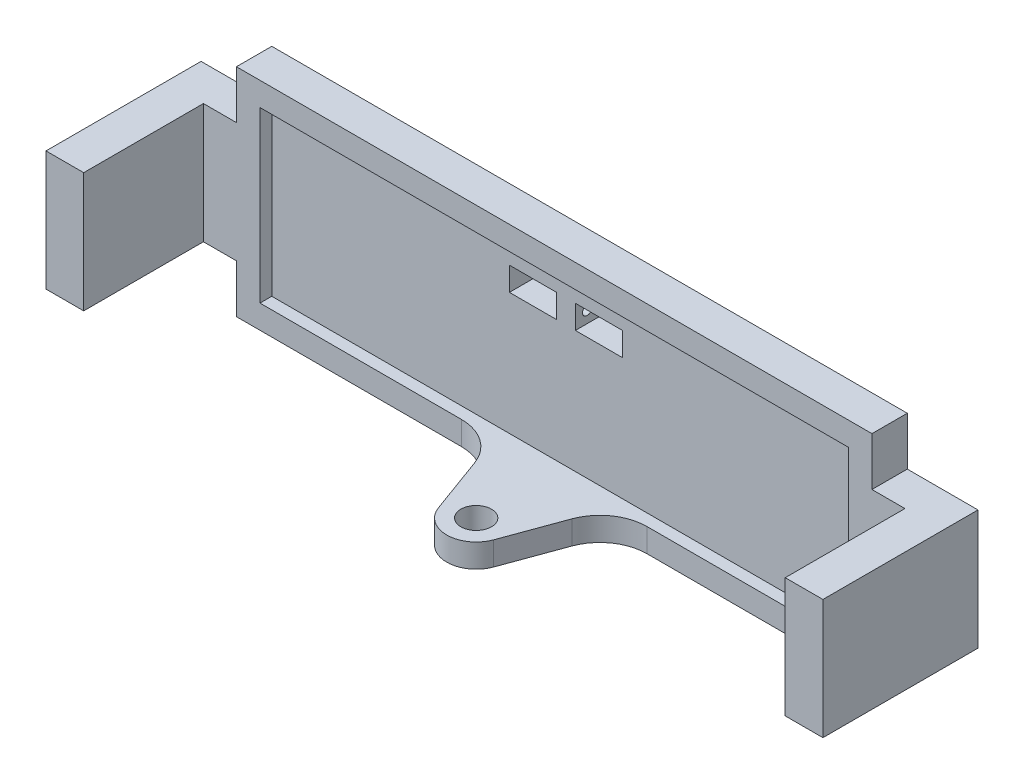
ISO-10303-21;
HEADER;
FILE_DESCRIPTION(('STEP AP214'),'2;1');
FILE_NAME('part.step','',(''),(''),'','','');
FILE_SCHEMA(('AUTOMOTIVE_DESIGN { 1 0 10303 214 1 1 1 1 }'));
ENDSEC;
DATA;
#1=APPLICATION_CONTEXT('core data for automotive mechanical design processes');
#2=APPLICATION_PROTOCOL_DEFINITION('international standard','automotive_design',2000,#1);
#3=PRODUCT_CONTEXT('',#1,'mechanical');
#4=PRODUCT('Part','Part','',(#3));
#5=PRODUCT_RELATED_PRODUCT_CATEGORY('part','',(#4));
#6=PRODUCT_DEFINITION_FORMATION('','',#4);
#7=PRODUCT_DEFINITION_CONTEXT('part definition',#1,'design');
#8=PRODUCT_DEFINITION('design','',#6,#7);
#9=PRODUCT_DEFINITION_SHAPE('','',#8);
#10=(LENGTH_UNIT() NAMED_UNIT(*) SI_UNIT(.MILLI.,.METRE.));
#11=(NAMED_UNIT(*) PLANE_ANGLE_UNIT() SI_UNIT($,.RADIAN.));
#12=(NAMED_UNIT(*) SI_UNIT($,.STERADIAN.) SOLID_ANGLE_UNIT());
#13=UNCERTAINTY_MEASURE_WITH_UNIT(LENGTH_MEASURE(1.E-05),#10,'distance_accuracy_value','');
#14=(GEOMETRIC_REPRESENTATION_CONTEXT(3) GLOBAL_UNCERTAINTY_ASSIGNED_CONTEXT((#13)) GLOBAL_UNIT_ASSIGNED_CONTEXT((#10,
#11,#12)) REPRESENTATION_CONTEXT('',''));
#15=CARTESIAN_POINT('',(0.,0.,0.));
#16=DIRECTION('',(0.,0.,1.));
#17=DIRECTION('',(1.,0.,0.));
#18=AXIS2_PLACEMENT_3D('',#15,#16,#17);
#19=CARTESIAN_POINT('',(0.,0.,5.));
#20=DIRECTION('',(0.,0.,-1.));
#21=DIRECTION('',(-1.,0.,0.));
#22=AXIS2_PLACEMENT_3D('',#19,#20,#21);
#23=PLANE('',#22);
#24=DIRECTION('',(-1.,0.,0.));
#25=VECTOR('',#24,1.);
#26=CARTESIAN_POINT('',(0.,12.7,5.));
#27=LINE('',#26,#25);
#28=CARTESIAN_POINT('',(-67.415,12.7000000000001,5.));
#29=VERTEX_POINT('',#28);
#30=CARTESIAN_POINT('',(-74.415,12.7000000000001,5.));
#31=VERTEX_POINT('',#30);
#32=EDGE_CURVE('E127',#29,#31,#27,.T.);
#33=ORIENTED_EDGE('',*,*,#32,.T.);
#34=DIRECTION('',(0.,-1.,0.));
#35=VECTOR('',#34,1.);
#36=CARTESIAN_POINT('',(-74.415,1.62632374758821E-13,5.));
#37=LINE('',#36,#35);
#38=CARTESIAN_POINT('',(-74.415,-12.6999999999999,5.));
#39=VERTEX_POINT('',#38);
#40=EDGE_CURVE('E122',#31,#39,#37,.T.);
#41=ORIENTED_EDGE('',*,*,#40,.T.);
#42=DIRECTION('',(-1.,0.,0.));
#43=VECTOR('',#42,1.);
#44=CARTESIAN_POINT('',(0.,-12.7,5.));
#45=LINE('',#44,#43);
#46=CARTESIAN_POINT('',(-67.415,-12.6999999999999,5.));
#47=VERTEX_POINT('',#46);
#48=EDGE_CURVE('E342',#47,#39,#45,.T.);
#49=ORIENTED_EDGE('',*,*,#48,.F.);
#50=DIRECTION('',(0.,1.,0.));
#51=VECTOR('',#50,1.);
#52=CARTESIAN_POINT('',(-67.415,0.,5.));
#53=LINE('',#52,#51);
#54=CARTESIAN_POINT('',(-67.415,-22.965,5.));
#55=VERTEX_POINT('',#54);
#56=EDGE_CURVE('E519',#55,#47,#53,.T.);
#57=ORIENTED_EDGE('',*,*,#56,.F.);
#58=DIRECTION('',(-1.,0.,0.));
#59=VECTOR('',#58,1.);
#60=CARTESIAN_POINT('',(0.,-22.965,5.));
#61=LINE('',#60,#59);
#62=CARTESIAN_POINT('',(-19.6932182980606,-22.965,5.));
#63=VERTEX_POINT('',#62);
#64=EDGE_CURVE('E507',#63,#55,#61,.T.);
#65=ORIENTED_EDGE('',*,*,#64,.F.);
#66=DIRECTION('',(0.,-1.,0.));
#67=VECTOR('',#66,1.);
#68=CARTESIAN_POINT('',(-19.6932182980606,0.,5.));
#69=LINE('',#68,#67);
#70=CARTESIAN_POINT('',(-19.6932182980606,-17.965,5.));
#71=VERTEX_POINT('',#70);
#72=EDGE_CURVE('E571',#63,#71,#69,.F.);
#73=ORIENTED_EDGE('',*,*,#72,.T.);
#74=DIRECTION('',(-1.,0.,0.));
#75=VECTOR('',#74,1.);
#76=CARTESIAN_POINT('',(0.,-17.965,5.));
#77=LINE('',#76,#75);
#78=CARTESIAN_POINT('',(-62.415,-17.965,5.));
#79=VERTEX_POINT('',#78);
#80=EDGE_CURVE('E490',#71,#79,#77,.T.);
#81=ORIENTED_EDGE('',*,*,#80,.T.);
#82=DIRECTION('',(0.,1.,0.));
#83=VECTOR('',#82,1.);
#84=CARTESIAN_POINT('',(-62.415,0.,5.));
#85=LINE('',#84,#83);
#86=CARTESIAN_POINT('',(-62.415,17.965,5.));
#87=VERTEX_POINT('',#86);
#88=EDGE_CURVE('E494',#79,#87,#85,.T.);
#89=ORIENTED_EDGE('',*,*,#88,.T.);
#90=DIRECTION('',(1.,0.,0.));
#91=VECTOR('',#90,1.);
#92=CARTESIAN_POINT('',(0.,17.965,5.));
#93=LINE('',#92,#91);
#94=CARTESIAN_POINT('',(62.415,17.965,5.));
#95=VERTEX_POINT('',#94);
#96=EDGE_CURVE('E497',#87,#95,#93,.T.);
#97=ORIENTED_EDGE('',*,*,#96,.T.);
#98=DIRECTION('',(0.,-1.,0.));
#99=VECTOR('',#98,1.);
#100=CARTESIAN_POINT('',(62.415,0.,5.));
#101=LINE('',#100,#99);
#102=CARTESIAN_POINT('',(62.415,-17.965,5.));
#103=VERTEX_POINT('',#102);
#104=EDGE_CURVE('E500',#95,#103,#101,.T.);
#105=ORIENTED_EDGE('',*,*,#104,.T.);
#106=CARTESIAN_POINT('',(19.6932182980606,-17.965,5.));
#107=VERTEX_POINT('',#106);
#108=EDGE_CURVE('E491',#103,#107,#77,.T.);
#109=ORIENTED_EDGE('',*,*,#108,.T.);
#110=DIRECTION('',(0.,-1.,0.));
#111=VECTOR('',#110,1.);
#112=CARTESIAN_POINT('',(19.6932182980606,-22.965,5.));
#113=LINE('',#112,#111);
#114=CARTESIAN_POINT('',(19.6932182980606,-22.965,5.));
#115=VERTEX_POINT('',#114);
#116=EDGE_CURVE('E568',#107,#115,#113,.T.);
#117=ORIENTED_EDGE('',*,*,#116,.T.);
#118=CARTESIAN_POINT('',(67.415,-22.965,5.));
#119=VERTEX_POINT('',#118);
#120=EDGE_CURVE('E515',#119,#115,#61,.T.);
#121=ORIENTED_EDGE('',*,*,#120,.F.);
#122=DIRECTION('',(0.,-1.,0.));
#123=VECTOR('',#122,1.);
#124=CARTESIAN_POINT('',(67.415,0.,5.));
#125=LINE('',#124,#123);
#126=CARTESIAN_POINT('',(67.415,-12.7,5.));
#127=VERTEX_POINT('',#126);
#128=EDGE_CURVE('E525',#127,#119,#125,.T.);
#129=ORIENTED_EDGE('',*,*,#128,.F.);
#130=DIRECTION('',(-1.,0.,0.));
#131=VECTOR('',#130,1.);
#132=CARTESIAN_POINT('',(0.,-12.7,5.));
#133=LINE('',#132,#131);
#134=CARTESIAN_POINT('',(74.415,-12.7,5.));
#135=VERTEX_POINT('',#134);
#136=EDGE_CURVE('E394',#135,#127,#133,.T.);
#137=ORIENTED_EDGE('',*,*,#136,.F.);
#138=DIRECTION('',(0.,-1.,0.));
#139=VECTOR('',#138,1.);
#140=CARTESIAN_POINT('',(74.415,0.,5.));
#141=LINE('',#140,#139);
#142=CARTESIAN_POINT('',(74.415,12.7,5.));
#143=VERTEX_POINT('',#142);
#144=EDGE_CURVE('E353',#143,#135,#141,.T.);
#145=ORIENTED_EDGE('',*,*,#144,.F.);
#146=DIRECTION('',(1.,0.,0.));
#147=VECTOR('',#146,1.);
#148=CARTESIAN_POINT('',(0.,12.7,5.));
#149=LINE('',#148,#147);
#150=CARTESIAN_POINT('',(67.415,12.7,5.));
#151=VERTEX_POINT('',#150);
#152=EDGE_CURVE('E391',#151,#143,#149,.T.);
#153=ORIENTED_EDGE('',*,*,#152,.F.);
#154=CARTESIAN_POINT('',(67.415,22.965,5.));
#155=VERTEX_POINT('',#154);
#156=EDGE_CURVE('E526',#155,#151,#125,.T.);
#157=ORIENTED_EDGE('',*,*,#156,.F.);
#158=DIRECTION('',(1.,0.,0.));
#159=VECTOR('',#158,1.);
#160=CARTESIAN_POINT('',(0.,22.965,5.));
#161=LINE('',#160,#159);
#162=CARTESIAN_POINT('',(-67.415,22.965,5.));
#163=VERTEX_POINT('',#162);
#164=EDGE_CURVE('E522',#163,#155,#161,.T.);
#165=ORIENTED_EDGE('',*,*,#164,.F.);
#166=EDGE_CURVE('E518',#29,#163,#53,.T.);
#167=ORIENTED_EDGE('',*,*,#166,.F.);
#168=EDGE_LOOP('',(#33,#41,#49,#57,#65,#73,#81,#89,#97,#105,#109,#117,#121,#129,#137,#145,#153,
#157,#165,#167));
#169=FACE_BOUND('',#168,.T.);
#170=ADVANCED_FACE('F107',(#169),#23,.F.);
#171=CARTESIAN_POINT('',(-67.415,0.,2.5));
#172=DIRECTION('',(1.,0.,0.));
#173=DIRECTION('',(0.,0.,-1.));
#174=AXIS2_PLACEMENT_3D('',#171,#172,#173);
#175=PLANE('',#174);
#176=DIRECTION('',(0.,0.,-1.));
#177=VECTOR('',#176,1.);
#178=CARTESIAN_POINT('',(-67.415,12.7000000000001,34.4984745368299));
#179=LINE('',#178,#177);
#180=CARTESIAN_POINT('',(-67.415,12.7000000000001,-2.5));
#181=VERTEX_POINT('',#180);
#182=EDGE_CURVE('E386',#29,#181,#179,.T.);
#183=ORIENTED_EDGE('',*,*,#182,.F.);
#184=ORIENTED_EDGE('',*,*,#166,.T.);
#185=DIRECTION('',(0.,0.,-1.));
#186=VECTOR('',#185,1.);
#187=CARTESIAN_POINT('',(-67.415,22.965,2.5));
#188=LINE('',#187,#186);
#189=CARTESIAN_POINT('',(-67.415,22.965,-2.5));
#190=VERTEX_POINT('',#189);
#191=EDGE_CURVE('E551',#163,#190,#188,.T.);
#192=ORIENTED_EDGE('',*,*,#191,.T.);
#193=DIRECTION('',(0.,-1.,0.));
#194=VECTOR('',#193,1.);
#195=CARTESIAN_POINT('',(-67.415,0.,-2.5));
#196=LINE('',#195,#194);
#197=EDGE_CURVE('E533',#190,#181,#196,.T.);
#198=ORIENTED_EDGE('',*,*,#197,.T.);
#199=EDGE_LOOP('',(#183,#184,#192,#198));
#200=FACE_BOUND('',#199,.T.);
#201=ADVANCED_FACE('F668',(#200),#175,.F.);
#202=CARTESIAN_POINT('',(67.415,0.,2.5));
#203=DIRECTION('',(1.,0.,0.));
#204=DIRECTION('',(0.,1.,0.));
#205=AXIS2_PLACEMENT_3D('',#202,#203,#204);
#206=PLANE('',#205);
#207=ORIENTED_EDGE('',*,*,#156,.T.);
#208=DIRECTION('',(0.,0.,-1.));
#209=VECTOR('',#208,1.);
#210=CARTESIAN_POINT('',(67.415,12.7,34.4984745368299));
#211=LINE('',#210,#209);
#212=CARTESIAN_POINT('',(67.415,12.7,-2.5));
#213=VERTEX_POINT('',#212);
#214=EDGE_CURVE('E409',#151,#213,#211,.T.);
#215=ORIENTED_EDGE('',*,*,#214,.T.);
#216=DIRECTION('',(0.,-1.,0.));
#217=VECTOR('',#216,1.);
#218=CARTESIAN_POINT('',(67.415,0.,-2.5));
#219=LINE('',#218,#217);
#220=CARTESIAN_POINT('',(67.415,22.965,-2.5));
#221=VERTEX_POINT('',#220);
#222=EDGE_CURVE('E540',#221,#213,#219,.T.);
#223=ORIENTED_EDGE('',*,*,#222,.F.);
#224=DIRECTION('',(0.,0.,-1.));
#225=VECTOR('',#224,1.);
#226=CARTESIAN_POINT('',(67.415,22.965,2.5));
#227=LINE('',#226,#225);
#228=EDGE_CURVE('E543',#155,#221,#227,.T.);
#229=ORIENTED_EDGE('',*,*,#228,.F.);
#230=EDGE_LOOP('',(#207,#215,#223,#229));
#231=FACE_BOUND('',#230,.T.);
#232=ADVANCED_FACE('F620',(#231),#206,.T.);
#233=CARTESIAN_POINT('',(0.,0.,-2.5));
#234=DIRECTION('',(0.,0.,1.));
#235=DIRECTION('',(1.,0.,0.));
#236=AXIS2_PLACEMENT_3D('',#233,#234,#235);
#237=PLANE('',#236);
#238=DIRECTION('',(-1.,0.,0.));
#239=VECTOR('',#238,1.);
#240=CARTESIAN_POINT('',(0.,12.965,-2.5));
#241=LINE('',#240,#239);
#242=CARTESIAN_POINT('',(12.,12.965,-2.5));
#243=VERTEX_POINT('',#242);
#244=CARTESIAN_POINT('',(2.,12.965,-2.5));
#245=VERTEX_POINT('',#244);
#246=EDGE_CURVE('E452',#243,#245,#241,.T.);
#247=ORIENTED_EDGE('',*,*,#246,.T.);
#248=DIRECTION('',(0.,-1.,0.));
#249=VECTOR('',#248,1.);
#250=CARTESIAN_POINT('',(2.,0.,-2.5));
#251=LINE('',#250,#249);
#252=CARTESIAN_POINT('',(2.,7.96500000000001,-2.5));
#253=VERTEX_POINT('',#252);
#254=EDGE_CURVE('E461',#245,#253,#251,.T.);
#255=ORIENTED_EDGE('',*,*,#254,.T.);
#256=DIRECTION('',(1.,0.,0.));
#257=VECTOR('',#256,1.);
#258=CARTESIAN_POINT('',(0.,7.96500000000001,-2.5));
#259=LINE('',#258,#257);
#260=CARTESIAN_POINT('',(12.,7.96500000000001,-2.5));
#261=VERTEX_POINT('',#260);
#262=EDGE_CURVE('E458',#253,#261,#259,.T.);
#263=ORIENTED_EDGE('',*,*,#262,.T.);
#264=DIRECTION('',(0.,1.,0.));
#265=VECTOR('',#264,1.);
#266=CARTESIAN_POINT('',(12.,0.,-2.5));
#267=LINE('',#266,#265);
#268=EDGE_CURVE('E455',#261,#243,#267,.T.);
#269=ORIENTED_EDGE('',*,*,#268,.T.);
#270=EDGE_LOOP('',(#247,#255,#263,#269));
#271=FACE_BOUND('',#270,.T.);
#272=DIRECTION('',(-1.,0.,0.));
#273=VECTOR('',#272,1.);
#274=CARTESIAN_POINT('',(0.,12.965,-2.5));
#275=LINE('',#274,#273);
#276=CARTESIAN_POINT('',(-1.99999999999997,12.965,-2.5));
#277=VERTEX_POINT('',#276);
#278=CARTESIAN_POINT('',(-12.,12.965,-2.5));
#279=VERTEX_POINT('',#278);
#280=EDGE_CURVE('E422',#277,#279,#275,.T.);
#281=ORIENTED_EDGE('',*,*,#280,.T.);
#282=DIRECTION('',(0.,-1.,0.));
#283=VECTOR('',#282,1.);
#284=CARTESIAN_POINT('',(-12.,0.,-2.5));
#285=LINE('',#284,#283);
#286=CARTESIAN_POINT('',(-12.,7.96500000000001,-2.5));
#287=VERTEX_POINT('',#286);
#288=EDGE_CURVE('E449',#279,#287,#285,.T.);
#289=ORIENTED_EDGE('',*,*,#288,.T.);
#290=DIRECTION('',(1.,0.,0.));
#291=VECTOR('',#290,1.);
#292=CARTESIAN_POINT('',(0.,7.96500000000001,-2.5));
#293=LINE('',#292,#291);
#294=CARTESIAN_POINT('',(-1.99999999999997,7.96500000000001,-2.5));
#295=VERTEX_POINT('',#294);
#296=EDGE_CURVE('E446',#287,#295,#293,.T.);
#297=ORIENTED_EDGE('',*,*,#296,.T.);
#298=DIRECTION('',(0.,1.,0.));
#299=VECTOR('',#298,1.);
#300=CARTESIAN_POINT('',(-1.99999999999997,0.,-2.5));
#301=LINE('',#300,#299);
#302=EDGE_CURVE('E443',#295,#277,#301,.T.);
#303=ORIENTED_EDGE('',*,*,#302,.T.);
#304=EDGE_LOOP('',(#281,#289,#297,#303));
#305=FACE_BOUND('',#304,.T.);
#306=DIRECTION('',(1.,0.,0.));
#307=VECTOR('',#306,1.);
#308=CARTESIAN_POINT('',(0.,22.965,-2.5));
#309=LINE('',#308,#307);
#310=EDGE_CURVE('E529',#190,#221,#309,.T.);
#311=ORIENTED_EDGE('',*,*,#310,.T.);
#312=ORIENTED_EDGE('',*,*,#222,.T.);
#313=DIRECTION('',(-1.,0.,0.));
#314=VECTOR('',#313,1.);
#315=CARTESIAN_POINT('',(0.,12.7,-2.5));
#316=LINE('',#315,#314);
#317=CARTESIAN_POINT('',(82.415,12.7,-2.5));
#318=VERTEX_POINT('',#317);
#319=EDGE_CURVE('E400',#318,#213,#316,.T.);
#320=ORIENTED_EDGE('',*,*,#319,.F.);
#321=DIRECTION('',(0.,-1.,0.));
#322=VECTOR('',#321,1.);
#323=CARTESIAN_POINT('',(82.415,0.,-2.5));
#324=LINE('',#323,#322);
#325=CARTESIAN_POINT('',(82.415,-12.7,-2.5));
#326=VERTEX_POINT('',#325);
#327=EDGE_CURVE('E402',#318,#326,#324,.T.);
#328=ORIENTED_EDGE('',*,*,#327,.T.);
#329=DIRECTION('',(1.,0.,0.));
#330=VECTOR('',#329,1.);
#331=CARTESIAN_POINT('',(0.,-12.7,-2.5));
#332=LINE('',#331,#330);
#333=CARTESIAN_POINT('',(67.415,-12.7,-2.5));
#334=VERTEX_POINT('',#333);
#335=EDGE_CURVE('E390',#334,#326,#332,.T.);
#336=ORIENTED_EDGE('',*,*,#335,.F.);
#337=CARTESIAN_POINT('',(67.415,-22.965,-2.5));
#338=VERTEX_POINT('',#337);
#339=EDGE_CURVE('E539',#334,#338,#219,.T.);
#340=ORIENTED_EDGE('',*,*,#339,.T.);
#341=DIRECTION('',(1.,0.,0.));
#342=VECTOR('',#341,1.);
#343=CARTESIAN_POINT('',(0.,-22.965,-2.5));
#344=LINE('',#343,#342);
#345=CARTESIAN_POINT('',(-67.415,-22.965,-2.5));
#346=VERTEX_POINT('',#345);
#347=EDGE_CURVE('E536',#346,#338,#344,.T.);
#348=ORIENTED_EDGE('',*,*,#347,.F.);
#349=CARTESIAN_POINT('',(-67.415,-12.6999999999999,-2.5));
#350=VERTEX_POINT('',#349);
#351=EDGE_CURVE('E532',#350,#346,#196,.T.);
#352=ORIENTED_EDGE('',*,*,#351,.F.);
#353=DIRECTION('',(1.,0.,0.));
#354=VECTOR('',#353,1.);
#355=CARTESIAN_POINT('',(0.,-12.7,-2.5));
#356=LINE('',#355,#354);
#357=CARTESIAN_POINT('',(-82.415,-12.6999999999999,-2.5));
#358=VERTEX_POINT('',#357);
#359=EDGE_CURVE('E379',#358,#350,#356,.T.);
#360=ORIENTED_EDGE('',*,*,#359,.F.);
#361=DIRECTION('',(0.,-1.,0.));
#362=VECTOR('',#361,1.);
#363=CARTESIAN_POINT('',(-82.415,1.80116201918272E-13,-2.5));
#364=LINE('',#363,#362);
#365=CARTESIAN_POINT('',(-82.415,12.7000000000001,-2.5));
#366=VERTEX_POINT('',#365);
#367=EDGE_CURVE('E369',#366,#358,#364,.T.);
#368=ORIENTED_EDGE('',*,*,#367,.F.);
#369=DIRECTION('',(1.,0.,0.));
#370=VECTOR('',#369,1.);
#371=CARTESIAN_POINT('',(0.,12.7,-2.5));
#372=LINE('',#371,#370);
#373=EDGE_CURVE('E376',#366,#181,#372,.T.);
#374=ORIENTED_EDGE('',*,*,#373,.T.);
#375=ORIENTED_EDGE('',*,*,#197,.F.);
#376=EDGE_LOOP('',(#311,#312,#320,#328,#336,#340,#348,#352,#360,#368,#374,#375));
#377=FACE_BOUND('',#376,.T.);
#378=ADVANCED_FACE('F616',(#271,#305,#377),#237,.F.);
#379=ORIENTED_EDGE('',*,*,#56,.T.);
#380=DIRECTION('',(0.,0.,-1.));
#381=VECTOR('',#380,1.);
#382=CARTESIAN_POINT('',(-67.415,-12.6999999999999,34.4984745368299));
#383=LINE('',#382,#381);
#384=EDGE_CURVE('E383',#47,#350,#383,.T.);
#385=ORIENTED_EDGE('',*,*,#384,.T.);
#386=ORIENTED_EDGE('',*,*,#351,.T.);
#387=DIRECTION('',(0.,0.,-1.));
#388=VECTOR('',#387,1.);
#389=CARTESIAN_POINT('',(-67.415,-22.965,2.5));
#390=LINE('',#389,#388);
#391=EDGE_CURVE('E548',#55,#346,#390,.T.);
#392=ORIENTED_EDGE('',*,*,#391,.F.);
#393=EDGE_LOOP('',(#379,#385,#386,#392));
#394=FACE_BOUND('',#393,.T.);
#395=ADVANCED_FACE('F619',(#394),#175,.F.);
#396=CARTESIAN_POINT('',(0.,-22.965,2.5));
#397=DIRECTION('',(0.,1.,0.));
#398=DIRECTION('',(0.,0.,1.));
#399=AXIS2_PLACEMENT_3D('',#396,#397,#398);
#400=PLANE('',#399);
#401=ORIENTED_EDGE('',*,*,#347,.T.);
#402=DIRECTION('',(0.,0.,-1.));
#403=VECTOR('',#402,1.);
#404=CARTESIAN_POINT('',(67.415,-22.965,2.5));
#405=LINE('',#404,#403);
#406=EDGE_CURVE('E545',#119,#338,#405,.T.);
#407=ORIENTED_EDGE('',*,*,#406,.F.);
#408=ORIENTED_EDGE('',*,*,#120,.T.);
#409=CARTESIAN_POINT('',(19.6932182980606,-22.965,15.));
#410=DIRECTION('',(0.,1.,0.));
#411=DIRECTION('',(0.,0.,1.));
#412=AXIS2_PLACEMENT_3D('',#409,#410,#411);
#413=CIRCLE('',#412,10.);
#414=CARTESIAN_POINT('',(10.3003658082339,-22.965,11.568626790284));
#415=VERTEX_POINT('',#414);
#416=EDGE_CURVE('E579',#115,#415,#413,.T.);
#417=ORIENTED_EDGE('',*,*,#416,.T.);
#418=DIRECTION('',(0.343137320971596,0.,-0.93928524898267));
#419=VECTOR('',#418,1.);
#420=CARTESIAN_POINT('',(12.816180212567,-22.965,4.68197466956128));
#421=LINE('',#420,#419);
#422=CARTESIAN_POINT('',(5.87053280614169,-22.965,23.6946082560725));
#423=VERTEX_POINT('',#422);
#424=EDGE_CURVE('E464',#423,#415,#421,.T.);
#425=ORIENTED_EDGE('',*,*,#424,.F.);
#426=CARTESIAN_POINT('',(0.,-22.965,21.55));
#427=DIRECTION('',(0.,-1.,0.));
#428=DIRECTION('',(0.,0.,-1.));
#429=AXIS2_PLACEMENT_3D('',#426,#427,#428);
#430=CIRCLE('',#429,6.25);
#431=CARTESIAN_POINT('',(-5.87053280614169,-22.965,23.6946082560725));
#432=VERTEX_POINT('',#431);
#433=EDGE_CURVE('E476',#423,#432,#430,.T.);
#434=ORIENTED_EDGE('',*,*,#433,.T.);
#435=DIRECTION('',(-0.343137320971596,0.,-0.93928524898267));
#436=VECTOR('',#435,1.);
#437=CARTESIAN_POINT('',(-12.816180212567,-22.965,4.68197466956128));
#438=LINE('',#437,#436);
#439=CARTESIAN_POINT('',(-10.3003658082339,-22.965,11.568626790284));
#440=VERTEX_POINT('',#439);
#441=EDGE_CURVE('E479',#432,#440,#438,.T.);
#442=ORIENTED_EDGE('',*,*,#441,.T.);
#443=CARTESIAN_POINT('',(-19.6932182980606,-22.965,15.));
#444=DIRECTION('',(0.,1.,0.));
#445=DIRECTION('',(0.,0.,1.));
#446=AXIS2_PLACEMENT_3D('',#443,#444,#445);
#447=CIRCLE('',#446,10.);
#448=EDGE_CURVE('E575',#440,#63,#447,.T.);
#449=ORIENTED_EDGE('',*,*,#448,.T.);
#450=ORIENTED_EDGE('',*,*,#64,.T.);
#451=ORIENTED_EDGE('',*,*,#391,.T.);
#452=EDGE_LOOP('',(#401,#407,#408,#417,#425,#434,#442,#449,#450,#451));
#453=FACE_BOUND('',#452,.T.);
#454=CARTESIAN_POINT('',(0.,-22.965,21.55));
#455=DIRECTION('',(0.,-1.,0.));
#456=DIRECTION('',(0.,0.,-1.));
#457=AXIS2_PLACEMENT_3D('',#454,#455,#456);
#458=CIRCLE('',#457,3.25);
#459=CARTESIAN_POINT('',(0.,-22.965,18.3));
#460=VERTEX_POINT('',#459);
#461=EDGE_CURVE('E482',#460,#460,#458,.T.);
#462=ORIENTED_EDGE('',*,*,#461,.F.);
#463=EDGE_LOOP('',(#462));
#464=FACE_BOUND('',#463,.T.);
#465=ADVANCED_FACE('F653',(#453,#464),#400,.F.);
#466=DIRECTION('',(0.,0.,-1.));
#467=VECTOR('',#466,1.);
#468=CARTESIAN_POINT('',(67.415,-12.7,34.4984745368299));
#469=LINE('',#468,#467);
#470=EDGE_CURVE('E405',#127,#334,#469,.T.);
#471=ORIENTED_EDGE('',*,*,#470,.F.);
#472=ORIENTED_EDGE('',*,*,#128,.T.);
#473=ORIENTED_EDGE('',*,*,#406,.T.);
#474=ORIENTED_EDGE('',*,*,#339,.F.);
#475=EDGE_LOOP('',(#471,#472,#473,#474));
#476=FACE_BOUND('',#475,.T.);
#477=ADVANCED_FACE('F648',(#476),#206,.T.);
#478=CARTESIAN_POINT('',(0.,22.965,2.5));
#479=DIRECTION('',(0.,1.,0.));
#480=DIRECTION('',(0.,0.,1.));
#481=AXIS2_PLACEMENT_3D('',#478,#479,#480);
#482=PLANE('',#481);
#483=ORIENTED_EDGE('',*,*,#310,.F.);
#484=ORIENTED_EDGE('',*,*,#191,.F.);
#485=ORIENTED_EDGE('',*,*,#164,.T.);
#486=ORIENTED_EDGE('',*,*,#228,.T.);
#487=EDGE_LOOP('',(#483,#484,#485,#486));
#488=FACE_BOUND('',#487,.T.);
#489=ADVANCED_FACE('F670',(#488),#482,.T.);
#490=CARTESIAN_POINT('',(0.,-17.965,5.));
#491=DIRECTION('',(0.,-1.,0.));
#492=DIRECTION('',(0.,0.,-1.));
#493=AXIS2_PLACEMENT_3D('',#490,#491,#492);
#494=PLANE('',#493);
#495=DIRECTION('',(1.,0.,0.));
#496=VECTOR('',#495,1.);
#497=CARTESIAN_POINT('',(0.,-17.965,2.5));
#498=LINE('',#497,#496);
#499=CARTESIAN_POINT('',(-62.415,-17.965,2.5));
#500=VERTEX_POINT('',#499);
#501=CARTESIAN_POINT('',(62.415,-17.965,2.5));
#502=VERTEX_POINT('',#501);
#503=EDGE_CURVE('E562',#500,#502,#498,.T.);
#504=ORIENTED_EDGE('',*,*,#503,.F.);
#505=DIRECTION('',(0.,0.,-1.));
#506=VECTOR('',#505,1.);
#507=CARTESIAN_POINT('',(-62.415,-17.965,5.));
#508=LINE('',#507,#506);
#509=EDGE_CURVE('E503',#79,#500,#508,.T.);
#510=ORIENTED_EDGE('',*,*,#509,.F.);
#511=ORIENTED_EDGE('',*,*,#80,.F.);
#512=CARTESIAN_POINT('',(-19.6932182980606,-17.965,15.));
#513=DIRECTION('',(0.,-1.,0.));
#514=DIRECTION('',(0.,0.,-1.));
#515=AXIS2_PLACEMENT_3D('',#512,#513,#514);
#516=CIRCLE('',#515,10.);
#517=CARTESIAN_POINT('',(-10.3003658082339,-17.965,11.568626790284));
#518=VERTEX_POINT('',#517);
#519=EDGE_CURVE('E577',#71,#518,#516,.T.);
#520=ORIENTED_EDGE('',*,*,#519,.T.);
#521=DIRECTION('',(0.343137320971596,0.,0.93928524898267));
#522=VECTOR('',#521,1.);
#523=CARTESIAN_POINT('',(-12.816180212567,-17.965,4.68197466956128));
#524=LINE('',#523,#522);
#525=CARTESIAN_POINT('',(-5.87053280614169,-17.965,23.6946082560725));
#526=VERTEX_POINT('',#525);
#527=EDGE_CURVE('E470',#518,#526,#524,.T.);
#528=ORIENTED_EDGE('',*,*,#527,.T.);
#529=CARTESIAN_POINT('',(0.,-17.965,21.55));
#530=DIRECTION('',(0.,-1.,0.));
#531=DIRECTION('',(0.,0.,-1.));
#532=AXIS2_PLACEMENT_3D('',#529,#530,#531);
#533=CIRCLE('',#532,6.25);
#534=CARTESIAN_POINT('',(5.87053280614169,-17.965,23.6946082560725));
#535=VERTEX_POINT('',#534);
#536=EDGE_CURVE('E465',#526,#535,#533,.F.);
#537=ORIENTED_EDGE('',*,*,#536,.T.);
#538=DIRECTION('',(-0.343137320971596,0.,0.93928524898267));
#539=VECTOR('',#538,1.);
#540=CARTESIAN_POINT('',(12.816180212567,-17.965,4.68197466956128));
#541=LINE('',#540,#539);
#542=CARTESIAN_POINT('',(10.3003658082339,-17.965,11.568626790284));
#543=VERTEX_POINT('',#542);
#544=EDGE_CURVE('E469',#543,#535,#541,.T.);
#545=ORIENTED_EDGE('',*,*,#544,.F.);
#546=CARTESIAN_POINT('',(19.6932182980606,-17.965,15.));
#547=DIRECTION('',(0.,-1.,0.));
#548=DIRECTION('',(0.,0.,-1.));
#549=AXIS2_PLACEMENT_3D('',#546,#547,#548);
#550=CIRCLE('',#549,10.);
#551=EDGE_CURVE('E581',#543,#107,#550,.T.);
#552=ORIENTED_EDGE('',*,*,#551,.T.);
#553=ORIENTED_EDGE('',*,*,#108,.F.);
#554=DIRECTION('',(0.,0.,-1.));
#555=VECTOR('',#554,1.);
#556=CARTESIAN_POINT('',(62.415,-17.965,5.));
#557=LINE('',#556,#555);
#558=EDGE_CURVE('E504',#103,#502,#557,.T.);
#559=ORIENTED_EDGE('',*,*,#558,.T.);
#560=EDGE_LOOP('',(#504,#510,#511,#520,#528,#537,#545,#552,#553,#559));
#561=FACE_BOUND('',#560,.T.);
#562=CARTESIAN_POINT('',(0.,-17.965,21.55));
#563=DIRECTION('',(0.,-1.,0.));
#564=DIRECTION('',(0.,0.,-1.));
#565=AXIS2_PLACEMENT_3D('',#562,#563,#564);
#566=CIRCLE('',#565,3.25);
#567=CARTESIAN_POINT('',(0.,-17.965,18.3));
#568=VERTEX_POINT('',#567);
#569=EDGE_CURVE('E468',#568,#568,#566,.F.);
#570=ORIENTED_EDGE('',*,*,#569,.F.);
#571=EDGE_LOOP('',(#570));
#572=FACE_BOUND('',#571,.T.);
#573=ADVANCED_FACE('F672',(#561,#572),#494,.F.);
#574=CARTESIAN_POINT('',(62.415,0.,5.));
#575=DIRECTION('',(1.,0.,0.));
#576=DIRECTION('',(0.,1.,0.));
#577=AXIS2_PLACEMENT_3D('',#574,#575,#576);
#578=PLANE('',#577);
#579=DIRECTION('',(0.,1.,0.));
#580=VECTOR('',#579,1.);
#581=CARTESIAN_POINT('',(62.415,0.,2.5));
#582=LINE('',#581,#580);
#583=CARTESIAN_POINT('',(62.415,17.965,2.5));
#584=VERTEX_POINT('',#583);
#585=EDGE_CURVE('E559',#502,#584,#582,.T.);
#586=ORIENTED_EDGE('',*,*,#585,.F.);
#587=ORIENTED_EDGE('',*,*,#558,.F.);
#588=ORIENTED_EDGE('',*,*,#104,.F.);
#589=DIRECTION('',(0.,0.,-1.));
#590=VECTOR('',#589,1.);
#591=CARTESIAN_POINT('',(62.415,17.965,5.));
#592=LINE('',#591,#590);
#593=EDGE_CURVE('E508',#95,#584,#592,.T.);
#594=ORIENTED_EDGE('',*,*,#593,.T.);
#595=EDGE_LOOP('',(#586,#587,#588,#594));
#596=FACE_BOUND('',#595,.T.);
#597=ADVANCED_FACE('F679',(#596),#578,.F.);
#598=CARTESIAN_POINT('',(0.,17.965,5.));
#599=DIRECTION('',(0.,1.,0.));
#600=DIRECTION('',(0.,0.,1.));
#601=AXIS2_PLACEMENT_3D('',#598,#599,#600);
#602=PLANE('',#601);
#603=DIRECTION('',(-1.,0.,0.));
#604=VECTOR('',#603,1.);
#605=CARTESIAN_POINT('',(0.,17.965,2.5));
#606=LINE('',#605,#604);
#607=CARTESIAN_POINT('',(-62.415,17.965,2.5));
#608=VERTEX_POINT('',#607);
#609=EDGE_CURVE('E556',#584,#608,#606,.T.);
#610=ORIENTED_EDGE('',*,*,#609,.F.);
#611=ORIENTED_EDGE('',*,*,#593,.F.);
#612=ORIENTED_EDGE('',*,*,#96,.F.);
#613=DIRECTION('',(0.,0.,-1.));
#614=VECTOR('',#613,1.);
#615=CARTESIAN_POINT('',(-62.415,17.965,5.));
#616=LINE('',#615,#614);
#617=EDGE_CURVE('E511',#87,#608,#616,.T.);
#618=ORIENTED_EDGE('',*,*,#617,.T.);
#619=EDGE_LOOP('',(#610,#611,#612,#618));
#620=FACE_BOUND('',#619,.T.);
#621=ADVANCED_FACE('F852',(#620),#602,.F.);
#622=CARTESIAN_POINT('',(-62.415,0.,5.));
#623=DIRECTION('',(-1.,0.,0.));
#624=DIRECTION('',(0.,-1.,0.));
#625=AXIS2_PLACEMENT_3D('',#622,#623,#624);
#626=PLANE('',#625);
#627=DIRECTION('',(0.,-1.,0.));
#628=VECTOR('',#627,1.);
#629=CARTESIAN_POINT('',(-62.415,0.,2.5));
#630=LINE('',#629,#628);
#631=EDGE_CURVE('E553',#608,#500,#630,.T.);
#632=ORIENTED_EDGE('',*,*,#631,.F.);
#633=ORIENTED_EDGE('',*,*,#617,.F.);
#634=ORIENTED_EDGE('',*,*,#88,.F.);
#635=ORIENTED_EDGE('',*,*,#509,.T.);
#636=EDGE_LOOP('',(#632,#633,#634,#635));
#637=FACE_BOUND('',#636,.T.);
#638=ADVANCED_FACE('F695',(#637),#626,.F.);
#639=CARTESIAN_POINT('',(0.,0.,2.5));
#640=DIRECTION('',(0.,0.,1.));
#641=DIRECTION('',(1.,0.,0.));
#642=AXIS2_PLACEMENT_3D('',#639,#640,#641);
#643=PLANE('',#642);
#644=DIRECTION('',(0.,-1.,0.));
#645=VECTOR('',#644,1.);
#646=CARTESIAN_POINT('',(2.,0.,2.5));
#647=LINE('',#646,#645);
#648=CARTESIAN_POINT('',(2.,12.965,2.5));
#649=VERTEX_POINT('',#648);
#650=CARTESIAN_POINT('',(2.,7.96500000000001,2.5));
#651=VERTEX_POINT('',#650);
#652=EDGE_CURVE('E12',#649,#651,#647,.T.);
#653=ORIENTED_EDGE('',*,*,#652,.F.);
#654=DIRECTION('',(-1.,0.,0.));
#655=VECTOR('',#654,1.);
#656=CARTESIAN_POINT('',(0.,12.965,2.5));
#657=LINE('',#656,#655);
#658=CARTESIAN_POINT('',(12.,12.965,2.5));
#659=VERTEX_POINT('',#658);
#660=EDGE_CURVE('E592',#659,#649,#657,.T.);
#661=ORIENTED_EDGE('',*,*,#660,.F.);
#662=DIRECTION('',(0.,1.,0.));
#663=VECTOR('',#662,1.);
#664=CARTESIAN_POINT('',(12.,0.,2.5));
#665=LINE('',#664,#663);
#666=CARTESIAN_POINT('',(12.,7.96500000000001,2.5));
#667=VERTEX_POINT('',#666);
#668=EDGE_CURVE('E594',#667,#659,#665,.T.);
#669=ORIENTED_EDGE('',*,*,#668,.F.);
#670=DIRECTION('',(1.,0.,0.));
#671=VECTOR('',#670,1.);
#672=CARTESIAN_POINT('',(0.,7.96500000000001,2.5));
#673=LINE('',#672,#671);
#674=EDGE_CURVE('E115',#651,#667,#673,.T.);
#675=ORIENTED_EDGE('',*,*,#674,.F.);
#676=EDGE_LOOP('',(#653,#661,#669,#675));
#677=FACE_BOUND('',#676,.T.);
#678=DIRECTION('',(0.,-1.,0.));
#679=VECTOR('',#678,1.);
#680=CARTESIAN_POINT('',(-12.,0.,2.5));
#681=LINE('',#680,#679);
#682=CARTESIAN_POINT('',(-12.,12.965,2.5));
#683=VERTEX_POINT('',#682);
#684=CARTESIAN_POINT('',(-12.,7.96500000000001,2.5));
#685=VERTEX_POINT('',#684);
#686=EDGE_CURVE('E590',#683,#685,#681,.T.);
#687=ORIENTED_EDGE('',*,*,#686,.F.);
#688=DIRECTION('',(-1.,0.,0.));
#689=VECTOR('',#688,1.);
#690=CARTESIAN_POINT('',(0.,12.965,2.5));
#691=LINE('',#690,#689);
#692=CARTESIAN_POINT('',(-1.99999999999997,12.965,2.5));
#693=VERTEX_POINT('',#692);
#694=EDGE_CURVE('E583',#693,#683,#691,.T.);
#695=ORIENTED_EDGE('',*,*,#694,.F.);
#696=DIRECTION('',(0.,1.,0.));
#697=VECTOR('',#696,1.);
#698=CARTESIAN_POINT('',(-1.99999999999997,0.,2.5));
#699=LINE('',#698,#697);
#700=CARTESIAN_POINT('',(-1.99999999999997,7.96500000000001,2.5));
#701=VERTEX_POINT('',#700);
#702=EDGE_CURVE('E585',#701,#693,#699,.T.);
#703=ORIENTED_EDGE('',*,*,#702,.F.);
#704=DIRECTION('',(1.,0.,0.));
#705=VECTOR('',#704,1.);
#706=CARTESIAN_POINT('',(0.,7.96500000000001,2.5));
#707=LINE('',#706,#705);
#708=EDGE_CURVE('E588',#685,#701,#707,.T.);
#709=ORIENTED_EDGE('',*,*,#708,.F.);
#710=EDGE_LOOP('',(#687,#695,#703,#709));
#711=FACE_BOUND('',#710,.T.);
#712=ORIENTED_EDGE('',*,*,#631,.T.);
#713=ORIENTED_EDGE('',*,*,#503,.T.);
#714=ORIENTED_EDGE('',*,*,#585,.T.);
#715=ORIENTED_EDGE('',*,*,#609,.T.);
#716=EDGE_LOOP('',(#712,#713,#714,#715));
#717=FACE_BOUND('',#716,.T.);
#718=ADVANCED_FACE('F607',(#677,#711,#717),#643,.T.);
#719=CARTESIAN_POINT('',(0.,16.167096331752,21.55));
#720=DIRECTION('',(0.,-1.,0.));
#721=DIRECTION('',(0.,0.,-1.));
#722=AXIS2_PLACEMENT_3D('',#719,#720,#721);
#723=CYLINDRICAL_SURFACE('',#722,6.25);
#724=ORIENTED_EDGE('',*,*,#536,.F.);
#725=DIRECTION('',(0.,-1.,0.));
#726=VECTOR('',#725,1.);
#727=CARTESIAN_POINT('',(-5.87053280614169,16.167096331752,23.6946082560725));
#728=LINE('',#727,#726);
#729=EDGE_CURVE('E472',#526,#432,#728,.T.);
#730=ORIENTED_EDGE('',*,*,#729,.T.);
#731=ORIENTED_EDGE('',*,*,#433,.F.);
#732=DIRECTION('',(0.,-1.,0.));
#733=VECTOR('',#732,1.);
#734=CARTESIAN_POINT('',(5.87053280614169,16.167096331752,23.6946082560725));
#735=LINE('',#734,#733);
#736=EDGE_CURVE('E485',#535,#423,#735,.T.);
#737=ORIENTED_EDGE('',*,*,#736,.F.);
#738=EDGE_LOOP('',(#724,#730,#731,#737));
#739=FACE_BOUND('',#738,.T.);
#740=ADVANCED_FACE('F694',(#739),#723,.T.);
#741=CARTESIAN_POINT('',(-12.816180212567,16.167096331752,4.68197466956128));
#742=DIRECTION('',(-0.93928524898267,0.,0.343137320971596));
#743=DIRECTION('',(0.343137320971596,0.,0.93928524898267));
#744=AXIS2_PLACEMENT_3D('',#741,#742,#743);
#745=PLANE('',#744);
#746=ORIENTED_EDGE('',*,*,#527,.F.);
#747=DIRECTION('',(0.,-1.,0.));
#748=VECTOR('',#747,1.);
#749=CARTESIAN_POINT('',(-10.3003658082339,16.167096331752,11.568626790284));
#750=LINE('',#749,#748);
#751=EDGE_CURVE('E565',#518,#440,#750,.T.);
#752=ORIENTED_EDGE('',*,*,#751,.T.);
#753=ORIENTED_EDGE('',*,*,#441,.F.);
#754=ORIENTED_EDGE('',*,*,#729,.F.);
#755=EDGE_LOOP('',(#746,#752,#753,#754));
#756=FACE_BOUND('',#755,.T.);
#757=ADVANCED_FACE('F841',(#756),#745,.T.);
#758=CARTESIAN_POINT('',(12.816180212567,16.167096331752,4.68197466956128));
#759=DIRECTION('',(-0.93928524898267,0.,-0.343137320971596));
#760=DIRECTION('',(-0.343137320971596,0.,0.93928524898267));
#761=AXIS2_PLACEMENT_3D('',#758,#759,#760);
#762=PLANE('',#761);
#763=ORIENTED_EDGE('',*,*,#424,.T.);
#764=DIRECTION('',(0.,-1.,0.));
#765=VECTOR('',#764,1.);
#766=CARTESIAN_POINT('',(10.3003658082339,-17.965,11.568626790284));
#767=LINE('',#766,#765);
#768=EDGE_CURVE('E573',#415,#543,#767,.F.);
#769=ORIENTED_EDGE('',*,*,#768,.T.);
#770=ORIENTED_EDGE('',*,*,#544,.T.);
#771=ORIENTED_EDGE('',*,*,#736,.T.);
#772=EDGE_LOOP('',(#763,#769,#770,#771));
#773=FACE_BOUND('',#772,.T.);
#774=ADVANCED_FACE('F839',(#773),#762,.F.);
#775=CARTESIAN_POINT('',(0.,16.167096331752,21.55));
#776=DIRECTION('',(0.,-1.,0.));
#777=DIRECTION('',(0.,0.,-1.));
#778=AXIS2_PLACEMENT_3D('',#775,#776,#777);
#779=CYLINDRICAL_SURFACE('',#778,3.25);
#780=ORIENTED_EDGE('',*,*,#569,.T.);
#781=EDGE_LOOP('',(#780));
#782=FACE_BOUND('',#781,.T.);
#783=ORIENTED_EDGE('',*,*,#461,.T.);
#784=EDGE_LOOP('',(#783));
#785=FACE_BOUND('',#784,.T.);
#786=ADVANCED_FACE('F835',(#782,#785),#779,.F.);
#787=CARTESIAN_POINT('',(-19.6932182980606,16.167096331752,15.));
#788=DIRECTION('',(0.,-1.,0.));
#789=DIRECTION('',(0.,0.,-1.));
#790=AXIS2_PLACEMENT_3D('',#787,#788,#789);
#791=CYLINDRICAL_SURFACE('',#790,10.);
#792=ORIENTED_EDGE('',*,*,#519,.F.);
#793=ORIENTED_EDGE('',*,*,#72,.F.);
#794=ORIENTED_EDGE('',*,*,#448,.F.);
#795=ORIENTED_EDGE('',*,*,#751,.F.);
#796=EDGE_LOOP('',(#792,#793,#794,#795));
#797=FACE_BOUND('',#796,.T.);
#798=ADVANCED_FACE('F838',(#797),#791,.F.);
#799=CARTESIAN_POINT('',(19.6932182980606,0.,15.));
#800=DIRECTION('',(0.,1.,0.));
#801=DIRECTION('',(0.,0.,1.));
#802=AXIS2_PLACEMENT_3D('',#799,#800,#801);
#803=CYLINDRICAL_SURFACE('',#802,10.);
#804=ORIENTED_EDGE('',*,*,#551,.F.);
#805=ORIENTED_EDGE('',*,*,#768,.F.);
#806=ORIENTED_EDGE('',*,*,#416,.F.);
#807=ORIENTED_EDGE('',*,*,#116,.F.);
#808=EDGE_LOOP('',(#804,#805,#806,#807));
#809=FACE_BOUND('',#808,.T.);
#810=ADVANCED_FACE('F109',(#809),#803,.F.);
#811=CARTESIAN_POINT('',(-12.,12.965,27.8));
#812=DIRECTION('',(-1.,0.,0.));
#813=DIRECTION('',(0.,-1.,0.));
#814=AXIS2_PLACEMENT_3D('',#811,#812,#813);
#815=PLANE('',#814);
#816=DIRECTION('',(0.,0.,-1.));
#817=VECTOR('',#816,1.);
#818=CARTESIAN_POINT('',(-12.,12.965,27.8));
#819=LINE('',#818,#817);
#820=EDGE_CURVE('E416',#683,#279,#819,.T.);
#821=ORIENTED_EDGE('',*,*,#820,.F.);
#822=ORIENTED_EDGE('',*,*,#686,.T.);
#823=DIRECTION('',(0.,0.,-1.));
#824=VECTOR('',#823,1.);
#825=CARTESIAN_POINT('',(-12.,7.96500000000001,27.8));
#826=LINE('',#825,#824);
#827=EDGE_CURVE('E431',#685,#287,#826,.T.);
#828=ORIENTED_EDGE('',*,*,#827,.T.);
#829=ORIENTED_EDGE('',*,*,#288,.F.);
#830=EDGE_LOOP('',(#821,#822,#828,#829));
#831=FACE_BOUND('',#830,.T.);
#832=ADVANCED_FACE('F824',(#831),#815,.F.);
#833=CARTESIAN_POINT('',(-12.,7.96500000000001,27.8));
#834=DIRECTION('',(0.,-1.,0.));
#835=DIRECTION('',(0.,0.,-1.));
#836=AXIS2_PLACEMENT_3D('',#833,#834,#835);
#837=PLANE('',#836);
#838=ORIENTED_EDGE('',*,*,#827,.F.);
#839=ORIENTED_EDGE('',*,*,#708,.T.);
#840=DIRECTION('',(0.,0.,-1.));
#841=VECTOR('',#840,1.);
#842=CARTESIAN_POINT('',(-1.99999999999997,7.96500000000001,27.8));
#843=LINE('',#842,#841);
#844=EDGE_CURVE('E434',#701,#295,#843,.T.);
#845=ORIENTED_EDGE('',*,*,#844,.T.);
#846=ORIENTED_EDGE('',*,*,#296,.F.);
#847=EDGE_LOOP('',(#838,#839,#845,#846));
#848=FACE_BOUND('',#847,.T.);
#849=ADVANCED_FACE('F820',(#848),#837,.F.);
#850=CARTESIAN_POINT('',(-1.99999999999997,12.965,27.8));
#851=DIRECTION('',(1.,0.,0.));
#852=DIRECTION('',(0.,0.,-1.));
#853=AXIS2_PLACEMENT_3D('',#850,#851,#852);
#854=PLANE('',#853);
#855=CARTESIAN_POINT('',(-1.99999999999997,10.465,0.));
#856=DIRECTION('',(1.,0.,0.));
#857=DIRECTION('',(0.,0.,-1.));
#858=AXIS2_PLACEMENT_3D('',#855,#856,#857);
#859=CIRCLE('',#858,1.);
#860=CARTESIAN_POINT('',(-1.99999999999997,10.465,-1.));
#861=VERTEX_POINT('',#860);
#862=EDGE_CURVE('E397',#861,#861,#859,.T.);
#863=ORIENTED_EDGE('',*,*,#862,.T.);
#864=EDGE_LOOP('',(#863));
#865=FACE_BOUND('',#864,.T.);
#866=ORIENTED_EDGE('',*,*,#844,.F.);
#867=ORIENTED_EDGE('',*,*,#702,.T.);
#868=DIRECTION('',(0.,0.,-1.));
#869=VECTOR('',#868,1.);
#870=CARTESIAN_POINT('',(-1.99999999999997,12.965,27.8));
#871=LINE('',#870,#869);
#872=EDGE_CURVE('E437',#693,#277,#871,.T.);
#873=ORIENTED_EDGE('',*,*,#872,.T.);
#874=ORIENTED_EDGE('',*,*,#302,.F.);
#875=EDGE_LOOP('',(#866,#867,#873,#874));
#876=FACE_BOUND('',#875,.T.);
#877=ADVANCED_FACE('F823',(#865,#876),#854,.F.);
#878=CARTESIAN_POINT('',(-12.,12.965,27.8));
#879=DIRECTION('',(0.,1.,0.));
#880=DIRECTION('',(0.,0.,1.));
#881=AXIS2_PLACEMENT_3D('',#878,#879,#880);
#882=PLANE('',#881);
#883=ORIENTED_EDGE('',*,*,#872,.F.);
#884=ORIENTED_EDGE('',*,*,#694,.T.);
#885=ORIENTED_EDGE('',*,*,#820,.T.);
#886=ORIENTED_EDGE('',*,*,#280,.F.);
#887=EDGE_LOOP('',(#883,#884,#885,#886));
#888=FACE_BOUND('',#887,.T.);
#889=ADVANCED_FACE('F818',(#888),#882,.F.);
#890=CARTESIAN_POINT('',(2.,12.965,27.8));
#891=DIRECTION('',(-1.,0.,0.));
#892=DIRECTION('',(0.,0.,1.));
#893=AXIS2_PLACEMENT_3D('',#890,#891,#892);
#894=PLANE('',#893);
#895=CARTESIAN_POINT('',(2.,10.465,0.));
#896=DIRECTION('',(-1.,0.,0.));
#897=DIRECTION('',(0.,0.,1.));
#898=AXIS2_PLACEMENT_3D('',#895,#896,#897);
#899=CIRCLE('',#898,1.);
#900=CARTESIAN_POINT('',(2.,10.465,1.));
#901=VERTEX_POINT('',#900);
#902=EDGE_CURVE('E413',#901,#901,#899,.T.);
#903=ORIENTED_EDGE('',*,*,#902,.T.);
#904=EDGE_LOOP('',(#903));
#905=FACE_BOUND('',#904,.T.);
#906=DIRECTION('',(0.,0.,-1.));
#907=VECTOR('',#906,1.);
#908=CARTESIAN_POINT('',(2.,12.965,27.8));
#909=LINE('',#908,#907);
#910=EDGE_CURVE('E429',#649,#245,#909,.T.);
#911=ORIENTED_EDGE('',*,*,#910,.F.);
#912=ORIENTED_EDGE('',*,*,#652,.T.);
#913=DIRECTION('',(0.,0.,-1.));
#914=VECTOR('',#913,1.);
#915=CARTESIAN_POINT('',(2.,7.96500000000001,27.8));
#916=LINE('',#915,#914);
#917=EDGE_CURVE('E419',#651,#253,#916,.T.);
#918=ORIENTED_EDGE('',*,*,#917,.T.);
#919=ORIENTED_EDGE('',*,*,#254,.F.);
#920=EDGE_LOOP('',(#911,#912,#918,#919));
#921=FACE_BOUND('',#920,.T.);
#922=ADVANCED_FACE('F614',(#905,#921),#894,.F.);
#923=CARTESIAN_POINT('',(12.,7.96500000000001,27.8));
#924=DIRECTION('',(0.,-1.,0.));
#925=DIRECTION('',(0.,0.,-1.));
#926=AXIS2_PLACEMENT_3D('',#923,#924,#925);
#927=PLANE('',#926);
#928=ORIENTED_EDGE('',*,*,#917,.F.);
#929=ORIENTED_EDGE('',*,*,#674,.T.);
#930=DIRECTION('',(0.,0.,-1.));
#931=VECTOR('',#930,1.);
#932=CARTESIAN_POINT('',(12.,7.96500000000001,27.8));
#933=LINE('',#932,#931);
#934=EDGE_CURVE('E423',#667,#261,#933,.T.);
#935=ORIENTED_EDGE('',*,*,#934,.T.);
#936=ORIENTED_EDGE('',*,*,#262,.F.);
#937=EDGE_LOOP('',(#928,#929,#935,#936));
#938=FACE_BOUND('',#937,.T.);
#939=ADVANCED_FACE('F600',(#938),#927,.F.);
#940=CARTESIAN_POINT('',(12.,12.965,27.8));
#941=DIRECTION('',(1.,0.,0.));
#942=DIRECTION('',(0.,1.,0.));
#943=AXIS2_PLACEMENT_3D('',#940,#941,#942);
#944=PLANE('',#943);
#945=ORIENTED_EDGE('',*,*,#934,.F.);
#946=ORIENTED_EDGE('',*,*,#668,.T.);
#947=DIRECTION('',(0.,0.,-1.));
#948=VECTOR('',#947,1.);
#949=CARTESIAN_POINT('',(12.,12.965,27.8));
#950=LINE('',#949,#948);
#951=EDGE_CURVE('E426',#659,#243,#950,.T.);
#952=ORIENTED_EDGE('',*,*,#951,.T.);
#953=ORIENTED_EDGE('',*,*,#268,.F.);
#954=EDGE_LOOP('',(#945,#946,#952,#953));
#955=FACE_BOUND('',#954,.T.);
#956=ADVANCED_FACE('F605',(#955),#944,.F.);
#957=CARTESIAN_POINT('',(12.,12.965,27.8));
#958=DIRECTION('',(0.,1.,0.));
#959=DIRECTION('',(0.,0.,1.));
#960=AXIS2_PLACEMENT_3D('',#957,#958,#959);
#961=PLANE('',#960);
#962=ORIENTED_EDGE('',*,*,#951,.F.);
#963=ORIENTED_EDGE('',*,*,#660,.T.);
#964=ORIENTED_EDGE('',*,*,#910,.T.);
#965=ORIENTED_EDGE('',*,*,#246,.F.);
#966=EDGE_LOOP('',(#962,#963,#964,#965));
#967=FACE_BOUND('',#966,.T.);
#968=ADVANCED_FACE('F611',(#967),#961,.F.);
#969=CARTESIAN_POINT('',(67.416,10.465,0.));
#970=DIRECTION('',(-1.,0.,0.));
#971=DIRECTION('',(0.,0.,1.));
#972=AXIS2_PLACEMENT_3D('',#969,#970,#971);
#973=CYLINDRICAL_SURFACE('',#972,1.);
#974=ORIENTED_EDGE('',*,*,#862,.F.);
#975=EDGE_LOOP('',(#974));
#976=FACE_BOUND('',#975,.T.);
#977=ORIENTED_EDGE('',*,*,#902,.F.);
#978=EDGE_LOOP('',(#977));
#979=FACE_BOUND('',#978,.T.);
#980=ADVANCED_FACE('F720',(#976,#979),#973,.F.);
#981=CARTESIAN_POINT('',(0.,12.7,34.4984745368299));
#982=DIRECTION('',(0.,-1.,0.));
#983=DIRECTION('',(0.,0.,-1.));
#984=AXIS2_PLACEMENT_3D('',#981,#982,#983);
#985=PLANE('',#984);
#986=ORIENTED_EDGE('',*,*,#214,.F.);
#987=ORIENTED_EDGE('',*,*,#152,.T.);
#988=DIRECTION('',(0.,0.,-1.));
#989=VECTOR('',#988,1.);
#990=CARTESIAN_POINT('',(74.415,12.7,30.4));
#991=LINE('',#990,#989);
#992=CARTESIAN_POINT('',(74.415,12.7,30.4));
#993=VERTEX_POINT('',#992);
#994=EDGE_CURVE('E367',#993,#143,#991,.T.);
#995=ORIENTED_EDGE('',*,*,#994,.F.);
#996=DIRECTION('',(-1.,0.,0.));
#997=VECTOR('',#996,1.);
#998=CARTESIAN_POINT('',(0.,12.7,30.4));
#999=LINE('',#998,#997);
#1000=CARTESIAN_POINT('',(82.415,12.7,30.4));
#1001=VERTEX_POINT('',#1000);
#1002=EDGE_CURVE('E360',#1001,#993,#999,.T.);
#1003=ORIENTED_EDGE('',*,*,#1002,.F.);
#1004=DIRECTION('',(0.,0.,-1.));
#1005=VECTOR('',#1004,1.);
#1006=CARTESIAN_POINT('',(82.415,12.7,34.4984745368299));
#1007=LINE('',#1006,#1005);
#1008=EDGE_CURVE('E407',#1001,#318,#1007,.T.);
#1009=ORIENTED_EDGE('',*,*,#1008,.T.);
#1010=ORIENTED_EDGE('',*,*,#319,.T.);
#1011=EDGE_LOOP('',(#986,#987,#995,#1003,#1009,#1010));
#1012=FACE_BOUND('',#1011,.T.);
#1013=ADVANCED_FACE('F633',(#1012),#985,.F.);
#1014=CARTESIAN_POINT('',(82.415,0.,34.4984745368299));
#1015=DIRECTION('',(1.,0.,0.));
#1016=DIRECTION('',(0.,0.,-1.));
#1017=AXIS2_PLACEMENT_3D('',#1014,#1015,#1016);
#1018=PLANE('',#1017);
#1019=ORIENTED_EDGE('',*,*,#1008,.F.);
#1020=DIRECTION('',(0.,-1.,0.));
#1021=VECTOR('',#1020,1.);
#1022=CARTESIAN_POINT('',(82.415,0.,30.4));
#1023=LINE('',#1022,#1021);
#1024=CARTESIAN_POINT('',(82.415,-12.7,30.4));
#1025=VERTEX_POINT('',#1024);
#1026=EDGE_CURVE('E362',#1001,#1025,#1023,.T.);
#1027=ORIENTED_EDGE('',*,*,#1026,.T.);
#1028=DIRECTION('',(0.,0.,-1.));
#1029=VECTOR('',#1028,1.);
#1030=CARTESIAN_POINT('',(82.415,-12.7,34.4984745368299));
#1031=LINE('',#1030,#1029);
#1032=EDGE_CURVE('E395',#1025,#326,#1031,.T.);
#1033=ORIENTED_EDGE('',*,*,#1032,.T.);
#1034=ORIENTED_EDGE('',*,*,#327,.F.);
#1035=EDGE_LOOP('',(#1019,#1027,#1033,#1034));
#1036=FACE_BOUND('',#1035,.T.);
#1037=ADVANCED_FACE('F639',(#1036),#1018,.T.);
#1038=CARTESIAN_POINT('',(0.,-12.7,34.4984745368299));
#1039=DIRECTION('',(0.,1.,0.));
#1040=DIRECTION('',(-1.,0.,0.));
#1041=AXIS2_PLACEMENT_3D('',#1038,#1039,#1040);
#1042=PLANE('',#1041);
#1043=ORIENTED_EDGE('',*,*,#1032,.F.);
#1044=DIRECTION('',(-1.,0.,0.));
#1045=VECTOR('',#1044,1.);
#1046=CARTESIAN_POINT('',(0.,-12.7,30.4));
#1047=LINE('',#1046,#1045);
#1048=CARTESIAN_POINT('',(74.415,-12.7,30.4));
#1049=VERTEX_POINT('',#1048);
#1050=EDGE_CURVE('E355',#1025,#1049,#1047,.T.);
#1051=ORIENTED_EDGE('',*,*,#1050,.T.);
#1052=DIRECTION('',(0.,0.,-1.));
#1053=VECTOR('',#1052,1.);
#1054=CARTESIAN_POINT('',(74.415,-12.7,30.4));
#1055=LINE('',#1054,#1053);
#1056=EDGE_CURVE('E365',#1049,#135,#1055,.T.);
#1057=ORIENTED_EDGE('',*,*,#1056,.T.);
#1058=ORIENTED_EDGE('',*,*,#136,.T.);
#1059=ORIENTED_EDGE('',*,*,#470,.T.);
#1060=ORIENTED_EDGE('',*,*,#335,.T.);
#1061=EDGE_LOOP('',(#1043,#1051,#1057,#1058,#1059,#1060));
#1062=FACE_BOUND('',#1061,.T.);
#1063=ADVANCED_FACE('F643',(#1062),#1042,.F.);
#1064=CARTESIAN_POINT('',(-82.415,1.80116201918272E-13,34.4984745368299));
#1065=DIRECTION('',(1.,0.,0.));
#1066=DIRECTION('',(0.,1.,0.));
#1067=AXIS2_PLACEMENT_3D('',#1064,#1065,#1066);
#1068=PLANE('',#1067);
#1069=DIRECTION('',(0.,0.,-1.));
#1070=VECTOR('',#1069,1.);
#1071=CARTESIAN_POINT('',(-82.415,-12.6999999999999,34.4984745368299));
#1072=LINE('',#1071,#1070);
#1073=CARTESIAN_POINT('',(-82.415,-12.6999999999999,30.4));
#1074=VERTEX_POINT('',#1073);
#1075=EDGE_CURVE('E373',#1074,#358,#1072,.T.);
#1076=ORIENTED_EDGE('',*,*,#1075,.F.);
#1077=DIRECTION('',(0.,-1.,0.));
#1078=VECTOR('',#1077,1.);
#1079=CARTESIAN_POINT('',(-82.415,1.80116201918272E-13,30.4));
#1080=LINE('',#1079,#1078);
#1081=CARTESIAN_POINT('',(-82.415,12.7000000000001,30.4));
#1082=VERTEX_POINT('',#1081);
#1083=EDGE_CURVE('E335',#1082,#1074,#1080,.T.);
#1084=ORIENTED_EDGE('',*,*,#1083,.F.);
#1085=DIRECTION('',(0.,0.,-1.));
#1086=VECTOR('',#1085,1.);
#1087=CARTESIAN_POINT('',(-82.415,12.7000000000001,34.4984745368299));
#1088=LINE('',#1087,#1086);
#1089=EDGE_CURVE('E381',#1082,#366,#1088,.T.);
#1090=ORIENTED_EDGE('',*,*,#1089,.T.);
#1091=ORIENTED_EDGE('',*,*,#367,.T.);
#1092=EDGE_LOOP('',(#1076,#1084,#1090,#1091));
#1093=FACE_BOUND('',#1092,.T.);
#1094=ADVANCED_FACE('F662',(#1093),#1068,.F.);
#1095=CARTESIAN_POINT('',(0.,-12.7,34.4984745368299));
#1096=DIRECTION('',(0.,1.,0.));
#1097=DIRECTION('',(-1.,0.,0.));
#1098=AXIS2_PLACEMENT_3D('',#1095,#1096,#1097);
#1099=PLANE('',#1098);
#1100=ORIENTED_EDGE('',*,*,#384,.F.);
#1101=ORIENTED_EDGE('',*,*,#48,.T.);
#1102=DIRECTION('',(0.,0.,-1.));
#1103=VECTOR('',#1102,1.);
#1104=CARTESIAN_POINT('',(-74.415,-12.6999999999999,30.4));
#1105=LINE('',#1104,#1103);
#1106=CARTESIAN_POINT('',(-74.415,-12.6999999999999,30.4));
#1107=VERTEX_POINT('',#1106);
#1108=EDGE_CURVE('E339',#1107,#39,#1105,.T.);
#1109=ORIENTED_EDGE('',*,*,#1108,.F.);
#1110=DIRECTION('',(1.,0.,0.));
#1111=VECTOR('',#1110,1.);
#1112=CARTESIAN_POINT('',(0.,-12.7,30.4));
#1113=LINE('',#1112,#1111);
#1114=EDGE_CURVE('E327',#1074,#1107,#1113,.T.);
#1115=ORIENTED_EDGE('',*,*,#1114,.F.);
#1116=ORIENTED_EDGE('',*,*,#1075,.T.);
#1117=ORIENTED_EDGE('',*,*,#359,.T.);
#1118=EDGE_LOOP('',(#1100,#1101,#1109,#1115,#1116,#1117));
#1119=FACE_BOUND('',#1118,.T.);
#1120=ADVANCED_FACE('F341',(#1119),#1099,.F.);
#1121=CARTESIAN_POINT('',(0.,12.7,34.4984745368299));
#1122=DIRECTION('',(0.,1.,0.));
#1123=DIRECTION('',(-1.,0.,0.));
#1124=AXIS2_PLACEMENT_3D('',#1121,#1122,#1123);
#1125=PLANE('',#1124);
#1126=ORIENTED_EDGE('',*,*,#32,.F.);
#1127=ORIENTED_EDGE('',*,*,#182,.T.);
#1128=ORIENTED_EDGE('',*,*,#373,.F.);
#1129=ORIENTED_EDGE('',*,*,#1089,.F.);
#1130=DIRECTION('',(1.,0.,0.));
#1131=VECTOR('',#1130,1.);
#1132=CARTESIAN_POINT('',(0.,12.7,30.4));
#1133=LINE('',#1132,#1131);
#1134=CARTESIAN_POINT('',(-74.415,12.7000000000001,30.4));
#1135=VERTEX_POINT('',#1134);
#1136=EDGE_CURVE('E345',#1082,#1135,#1133,.T.);
#1137=ORIENTED_EDGE('',*,*,#1136,.T.);
#1138=DIRECTION('',(0.,0.,-1.));
#1139=VECTOR('',#1138,1.);
#1140=CARTESIAN_POINT('',(-74.415,12.7000000000001,30.4));
#1141=LINE('',#1140,#1139);
#1142=EDGE_CURVE('E344',#1135,#31,#1141,.T.);
#1143=ORIENTED_EDGE('',*,*,#1142,.T.);
#1144=EDGE_LOOP('',(#1126,#1127,#1128,#1129,#1137,#1143));
#1145=FACE_BOUND('',#1144,.T.);
#1146=ADVANCED_FACE('F665',(#1145),#1125,.T.);
#1147=CARTESIAN_POINT('',(74.415,0.,30.4));
#1148=DIRECTION('',(1.,0.,0.));
#1149=DIRECTION('',(0.,0.,-1.));
#1150=AXIS2_PLACEMENT_3D('',#1147,#1148,#1149);
#1151=PLANE('',#1150);
#1152=ORIENTED_EDGE('',*,*,#144,.T.);
#1153=ORIENTED_EDGE('',*,*,#1056,.F.);
#1154=DIRECTION('',(0.,-1.,0.));
#1155=VECTOR('',#1154,1.);
#1156=CARTESIAN_POINT('',(74.415,0.,30.4));
#1157=LINE('',#1156,#1155);
#1158=EDGE_CURVE('E358',#993,#1049,#1157,.T.);
#1159=ORIENTED_EDGE('',*,*,#1158,.F.);
#1160=ORIENTED_EDGE('',*,*,#994,.T.);
#1161=EDGE_LOOP('',(#1152,#1153,#1159,#1160));
#1162=FACE_BOUND('',#1161,.T.);
#1163=ADVANCED_FACE('F767',(#1162),#1151,.F.);
#1164=CARTESIAN_POINT('',(0.,0.,30.4));
#1165=DIRECTION('',(0.,0.,1.));
#1166=DIRECTION('',(1.,0.,0.));
#1167=AXIS2_PLACEMENT_3D('',#1164,#1165,#1166);
#1168=PLANE('',#1167);
#1169=ORIENTED_EDGE('',*,*,#1050,.F.);
#1170=ORIENTED_EDGE('',*,*,#1026,.F.);
#1171=ORIENTED_EDGE('',*,*,#1002,.T.);
#1172=ORIENTED_EDGE('',*,*,#1158,.T.);
#1173=EDGE_LOOP('',(#1169,#1170,#1171,#1172));
#1174=FACE_BOUND('',#1173,.T.);
#1175=ADVANCED_FACE('F777',(#1174),#1168,.T.);
#1176=CARTESIAN_POINT('',(-74.415,1.62632374758821E-13,30.4));
#1177=DIRECTION('',(1.,0.,0.));
#1178=DIRECTION('',(0.,1.,0.));
#1179=AXIS2_PLACEMENT_3D('',#1176,#1177,#1178);
#1180=PLANE('',#1179);
#1181=ORIENTED_EDGE('',*,*,#40,.F.);
#1182=ORIENTED_EDGE('',*,*,#1142,.F.);
#1183=DIRECTION('',(0.,-1.,0.));
#1184=VECTOR('',#1183,1.);
#1185=CARTESIAN_POINT('',(-74.415,1.62632374758821E-13,30.4));
#1186=LINE('',#1185,#1184);
#1187=EDGE_CURVE('E332',#1135,#1107,#1186,.T.);
#1188=ORIENTED_EDGE('',*,*,#1187,.T.);
#1189=ORIENTED_EDGE('',*,*,#1108,.T.);
#1190=EDGE_LOOP('',(#1181,#1182,#1188,#1189));
#1191=FACE_BOUND('',#1190,.T.);
#1192=ADVANCED_FACE('F347',(#1191),#1180,.T.);
#1193=CARTESIAN_POINT('',(0.,0.,30.4));
#1194=DIRECTION('',(0.,0.,1.));
#1195=DIRECTION('',(1.,0.,0.));
#1196=AXIS2_PLACEMENT_3D('',#1193,#1194,#1195);
#1197=PLANE('',#1196);
#1198=ORIENTED_EDGE('',*,*,#1187,.F.);
#1199=ORIENTED_EDGE('',*,*,#1136,.F.);
#1200=ORIENTED_EDGE('',*,*,#1083,.T.);
#1201=ORIENTED_EDGE('',*,*,#1114,.T.);
#1202=EDGE_LOOP('',(#1198,#1199,#1200,#1201));
#1203=FACE_BOUND('',#1202,.T.);
#1204=ADVANCED_FACE('F329',(#1203),#1197,.T.);
#1205=CLOSED_SHELL('',(#170,#201,#232,#378,#395,#465,#477,#489,#573,#597,#621,#638,#718,#740,
#757,#774,#786,#798,#810,#832,#849,#877,#889,#922,#939,#956,#968,#980,#1013,#1037,#1063,#1094,
#1120,#1146,#1163,#1175,#1192,#1204));
#1206=MANIFOLD_SOLID_BREP('B2',#1205);
#1207=ADVANCED_BREP_SHAPE_REPRESENTATION('',(#18,#1206),#14);
#1208=SHAPE_DEFINITION_REPRESENTATION(#9,#1207);
ENDSEC;
END-ISO-10303-21;
